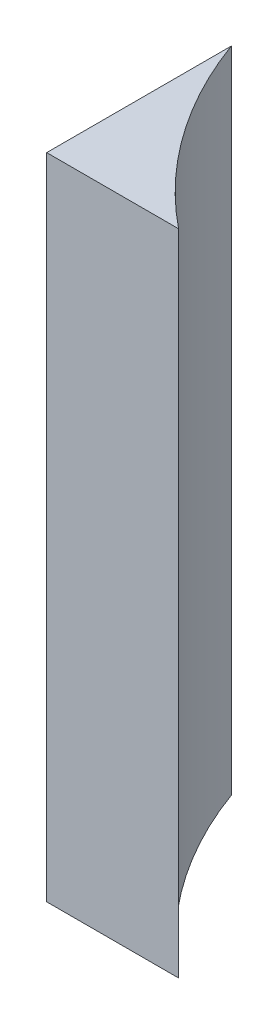
ISO-10303-21;
HEADER;
FILE_DESCRIPTION(('STEP AP214'),'2;1');
FILE_NAME('part.step','',(''),(''),'','','');
FILE_SCHEMA(('AUTOMOTIVE_DESIGN { 1 0 10303 214 1 1 1 1 }'));
ENDSEC;
DATA;
#1=APPLICATION_CONTEXT('core data for automotive mechanical design processes');
#2=APPLICATION_PROTOCOL_DEFINITION('international standard','automotive_design',2000,#1);
#3=PRODUCT_CONTEXT('',#1,'mechanical');
#4=PRODUCT('Part','Part','',(#3));
#5=PRODUCT_RELATED_PRODUCT_CATEGORY('part','',(#4));
#6=PRODUCT_DEFINITION_FORMATION('','',#4);
#7=PRODUCT_DEFINITION_CONTEXT('part definition',#1,'design');
#8=PRODUCT_DEFINITION('design','',#6,#7);
#9=PRODUCT_DEFINITION_SHAPE('','',#8);
#10=(LENGTH_UNIT() NAMED_UNIT(*) SI_UNIT(.MILLI.,.METRE.));
#11=(NAMED_UNIT(*) PLANE_ANGLE_UNIT() SI_UNIT($,.RADIAN.));
#12=(NAMED_UNIT(*) SI_UNIT($,.STERADIAN.) SOLID_ANGLE_UNIT());
#13=UNCERTAINTY_MEASURE_WITH_UNIT(LENGTH_MEASURE(1.E-05),#10,'distance_accuracy_value','');
#14=(GEOMETRIC_REPRESENTATION_CONTEXT(3) GLOBAL_UNCERTAINTY_ASSIGNED_CONTEXT((#13)) GLOBAL_UNIT_ASSIGNED_CONTEXT((#10,
#11,#12)) REPRESENTATION_CONTEXT('',''));
#15=CARTESIAN_POINT('',(0.,0.,0.));
#16=DIRECTION('',(0.,0.,1.));
#17=DIRECTION('',(1.,0.,0.));
#18=AXIS2_PLACEMENT_3D('',#15,#16,#17);
#19=CARTESIAN_POINT('',(25.,123.,0.));
#20=DIRECTION('',(0.,0.,-1.));
#21=DIRECTION('',(-1.,0.,0.));
#22=AXIS2_PLACEMENT_3D('',#19,#20,#21);
#23=PLANE('',#22);
#24=DIRECTION('',(1.,0.,0.));
#25=VECTOR('',#24,1.);
#26=CARTESIAN_POINT('',(25.,0.,0.));
#27=LINE('',#26,#25);
#28=CARTESIAN_POINT('',(0.,0.,0.));
#29=VERTEX_POINT('',#28);
#30=CARTESIAN_POINT('',(25.,0.,0.));
#31=VERTEX_POINT('',#30);
#32=EDGE_CURVE('E84',#29,#31,#27,.T.);
#33=ORIENTED_EDGE('',*,*,#32,.T.);
#34=DIRECTION('',(0.,-1.,0.));
#35=VECTOR('',#34,1.);
#36=CARTESIAN_POINT('',(25.,123.,0.));
#37=LINE('',#36,#35);
#38=CARTESIAN_POINT('',(25.,123.,0.));
#39=VERTEX_POINT('',#38);
#40=EDGE_CURVE('E11',#39,#31,#37,.T.);
#41=ORIENTED_EDGE('',*,*,#40,.F.);
#42=DIRECTION('',(1.,0.,0.));
#43=VECTOR('',#42,1.);
#44=CARTESIAN_POINT('',(25.,123.,0.));
#45=LINE('',#44,#43);
#46=CARTESIAN_POINT('',(0.,123.,0.));
#47=VERTEX_POINT('',#46);
#48=EDGE_CURVE('E77',#47,#39,#45,.T.);
#49=ORIENTED_EDGE('',*,*,#48,.F.);
#50=DIRECTION('',(0.,-1.,0.));
#51=VECTOR('',#50,1.);
#52=CARTESIAN_POINT('',(0.,123.,0.));
#53=LINE('',#52,#51);
#54=EDGE_CURVE('E85',#47,#29,#53,.T.);
#55=ORIENTED_EDGE('',*,*,#54,.T.);
#56=EDGE_LOOP('',(#33,#41,#49,#55));
#57=FACE_BOUND('',#56,.T.);
#58=ADVANCED_FACE('F37',(#57),#23,.F.);
#59=CARTESIAN_POINT('',(75.2023750573919,123.,-62.2874107552799));
#60=DIRECTION('',(0.,-1.,0.));
#61=DIRECTION('',(0.,0.,-1.));
#62=AXIS2_PLACEMENT_3D('',#59,#60,#61);
#63=CYLINDRICAL_SURFACE('',#62,80.);
#64=CARTESIAN_POINT('',(75.2023750573919,0.,-62.2874107552799));
#65=DIRECTION('',(0.,-1.,0.));
#66=DIRECTION('',(0.,0.,1.));
#67=AXIS2_PLACEMENT_3D('',#64,#65,#66);
#68=CIRCLE('',#67,80.);
#69=CARTESIAN_POINT('',(0.,0.,-35.));
#70=VERTEX_POINT('',#69);
#71=EDGE_CURVE('E65',#31,#70,#68,.T.);
#72=ORIENTED_EDGE('',*,*,#71,.T.);
#73=DIRECTION('',(0.,-1.,0.));
#74=VECTOR('',#73,1.);
#75=CARTESIAN_POINT('',(0.,123.,-35.));
#76=LINE('',#75,#74);
#77=CARTESIAN_POINT('',(0.,123.,-35.));
#78=VERTEX_POINT('',#77);
#79=EDGE_CURVE('E45',#78,#70,#76,.T.);
#80=ORIENTED_EDGE('',*,*,#79,.F.);
#81=CARTESIAN_POINT('',(75.2023750573919,123.,-62.2874107552799));
#82=DIRECTION('',(0.,-1.,0.));
#83=DIRECTION('',(0.,0.,1.));
#84=AXIS2_PLACEMENT_3D('',#81,#82,#83);
#85=CIRCLE('',#84,80.);
#86=EDGE_CURVE('E73',#39,#78,#85,.T.);
#87=ORIENTED_EDGE('',*,*,#86,.F.);
#88=ORIENTED_EDGE('',*,*,#40,.T.);
#89=EDGE_LOOP('',(#72,#80,#87,#88));
#90=FACE_BOUND('',#89,.T.);
#91=ADVANCED_FACE('F74',(#90),#63,.F.);
#92=CARTESIAN_POINT('',(0.,123.,0.));
#93=DIRECTION('',(1.,0.,0.));
#94=DIRECTION('',(0.,0.,-1.));
#95=AXIS2_PLACEMENT_3D('',#92,#93,#94);
#96=PLANE('',#95);
#97=DIRECTION('',(0.,0.,1.));
#98=VECTOR('',#97,1.);
#99=CARTESIAN_POINT('',(0.,0.,0.));
#100=LINE('',#99,#98);
#101=EDGE_CURVE('E70',#70,#29,#100,.T.);
#102=ORIENTED_EDGE('',*,*,#101,.T.);
#103=ORIENTED_EDGE('',*,*,#54,.F.);
#104=DIRECTION('',(0.,0.,1.));
#105=VECTOR('',#104,1.);
#106=CARTESIAN_POINT('',(0.,123.,0.));
#107=LINE('',#106,#105);
#108=EDGE_CURVE('E53',#78,#47,#107,.T.);
#109=ORIENTED_EDGE('',*,*,#108,.F.);
#110=ORIENTED_EDGE('',*,*,#79,.T.);
#111=EDGE_LOOP('',(#102,#103,#109,#110));
#112=FACE_BOUND('',#111,.T.);
#113=ADVANCED_FACE('F92',(#112),#96,.F.);
#114=CARTESIAN_POINT('',(75.2023750573919,123.,-62.2874107552799));
#115=DIRECTION('',(0.,1.,0.));
#116=DIRECTION('',(0.,0.,1.));
#117=AXIS2_PLACEMENT_3D('',#114,#115,#116);
#118=PLANE('',#117);
#119=ORIENTED_EDGE('',*,*,#48,.T.);
#120=ORIENTED_EDGE('',*,*,#86,.T.);
#121=ORIENTED_EDGE('',*,*,#108,.T.);
#122=EDGE_LOOP('',(#119,#120,#121));
#123=FACE_BOUND('',#122,.T.);
#124=ADVANCED_FACE('F80',(#123),#118,.T.);
#125=CARTESIAN_POINT('',(75.2023750573919,0.,-62.2874107552799));
#126=DIRECTION('',(0.,1.,0.));
#127=DIRECTION('',(0.,0.,1.));
#128=AXIS2_PLACEMENT_3D('',#125,#126,#127);
#129=PLANE('',#128);
#130=ORIENTED_EDGE('',*,*,#32,.F.);
#131=ORIENTED_EDGE('',*,*,#101,.F.);
#132=ORIENTED_EDGE('',*,*,#71,.F.);
#133=EDGE_LOOP('',(#130,#131,#132));
#134=FACE_BOUND('',#133,.T.);
#135=ADVANCED_FACE('F93',(#134),#129,.F.);
#136=CLOSED_SHELL('',(#58,#91,#113,#124,#135));
#137=MANIFOLD_SOLID_BREP('B2',#136);
#138=ADVANCED_BREP_SHAPE_REPRESENTATION('',(#18,#137),#14);
#139=SHAPE_DEFINITION_REPRESENTATION(#9,#138);
ENDSEC;
END-ISO-10303-21;
